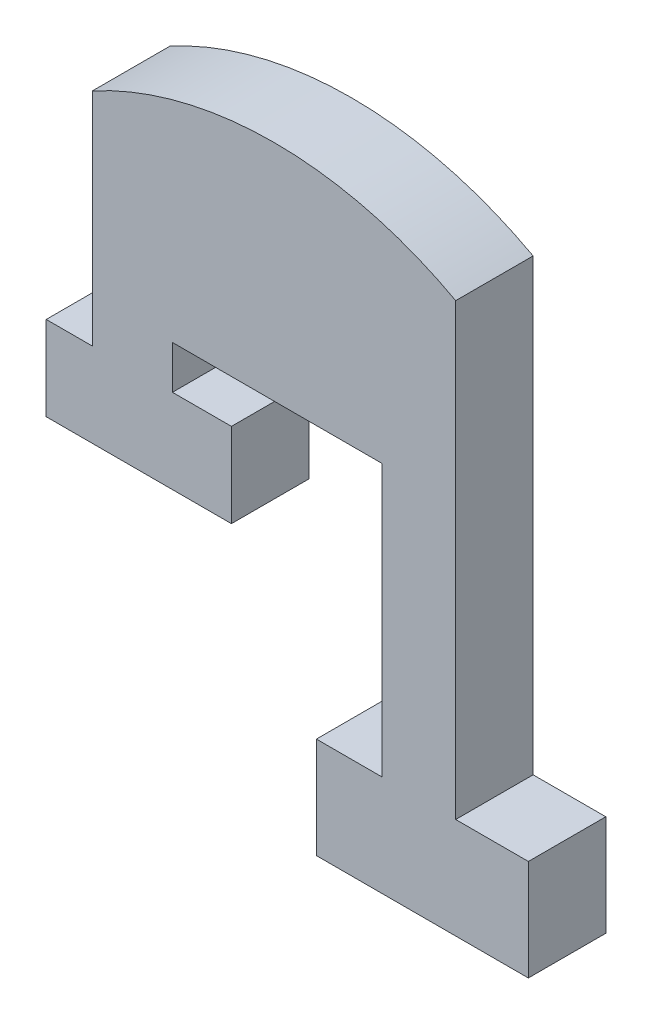
ISO-10303-21;
HEADER;
FILE_DESCRIPTION(('STEP AP214'),'2;1');
FILE_NAME('part.step','',(''),(''),'','','');
FILE_SCHEMA(('AUTOMOTIVE_DESIGN { 1 0 10303 214 1 1 1 1 }'));
ENDSEC;
DATA;
#1=APPLICATION_CONTEXT('core data for automotive mechanical design processes');
#2=APPLICATION_PROTOCOL_DEFINITION('international standard','automotive_design',2000,#1);
#3=PRODUCT_CONTEXT('',#1,'mechanical');
#4=PRODUCT('Part','Part','',(#3));
#5=PRODUCT_RELATED_PRODUCT_CATEGORY('part','',(#4));
#6=PRODUCT_DEFINITION_FORMATION('','',#4);
#7=PRODUCT_DEFINITION_CONTEXT('part definition',#1,'design');
#8=PRODUCT_DEFINITION('design','',#6,#7);
#9=PRODUCT_DEFINITION_SHAPE('','',#8);
#10=(LENGTH_UNIT() NAMED_UNIT(*) SI_UNIT(.MILLI.,.METRE.));
#11=(NAMED_UNIT(*) PLANE_ANGLE_UNIT() SI_UNIT($,.RADIAN.));
#12=(NAMED_UNIT(*) SI_UNIT($,.STERADIAN.) SOLID_ANGLE_UNIT());
#13=UNCERTAINTY_MEASURE_WITH_UNIT(LENGTH_MEASURE(1.E-05),#10,'distance_accuracy_value','');
#14=(GEOMETRIC_REPRESENTATION_CONTEXT(3) GLOBAL_UNCERTAINTY_ASSIGNED_CONTEXT((#13)) GLOBAL_UNIT_ASSIGNED_CONTEXT((#10,
#11,#12)) REPRESENTATION_CONTEXT('',''));
#15=CARTESIAN_POINT('',(0.,0.,0.));
#16=DIRECTION('',(0.,0.,1.));
#17=DIRECTION('',(1.,0.,0.));
#18=AXIS2_PLACEMENT_3D('',#15,#16,#17);
#19=CARTESIAN_POINT('',(16.9520275868381,0.,20.));
#20=DIRECTION('',(-1.,0.,0.));
#21=DIRECTION('',(0.,0.,1.));
#22=AXIS2_PLACEMENT_3D('',#19,#20,#21);
#23=PLANE('',#22);
#24=DIRECTION('',(0.,1.,0.));
#25=VECTOR('',#24,1.);
#26=CARTESIAN_POINT('',(16.9520275868381,0.,0.));
#27=LINE('',#26,#25);
#28=CARTESIAN_POINT('',(16.9520275868381,-70.1347932398303,0.));
#29=VERTEX_POINT('',#28);
#30=CARTESIAN_POINT('',(16.9520275868381,0.,0.));
#31=VERTEX_POINT('',#30);
#32=EDGE_CURVE('E80',#29,#31,#27,.T.);
#33=ORIENTED_EDGE('',*,*,#32,.F.);
#34=DIRECTION('',(0.,0.,1.));
#35=VECTOR('',#34,1.);
#36=CARTESIAN_POINT('',(16.9520275868381,-70.1347932398303,20.));
#37=LINE('',#36,#35);
#38=CARTESIAN_POINT('',(16.9520275868381,-70.1347932398303,20.));
#39=VERTEX_POINT('',#38);
#40=EDGE_CURVE('E173',#29,#39,#37,.T.);
#41=ORIENTED_EDGE('',*,*,#40,.T.);
#42=DIRECTION('',(0.,1.,0.));
#43=VECTOR('',#42,1.);
#44=CARTESIAN_POINT('',(16.9520275868381,0.,20.));
#45=LINE('',#44,#43);
#46=CARTESIAN_POINT('',(16.9520275868381,0.,20.));
#47=VERTEX_POINT('',#46);
#48=EDGE_CURVE('E285',#39,#47,#45,.T.);
#49=ORIENTED_EDGE('',*,*,#48,.T.);
#50=DIRECTION('',(0.,0.,-1.));
#51=VECTOR('',#50,1.);
#52=CARTESIAN_POINT('',(16.9520275868381,0.,20.));
#53=LINE('',#52,#51);
#54=EDGE_CURVE('E310',#47,#31,#53,.T.);
#55=ORIENTED_EDGE('',*,*,#54,.T.);
#56=EDGE_LOOP('',(#33,#41,#49,#55));
#57=FACE_BOUND('',#56,.T.);
#58=ADVANCED_FACE('F43',(#57),#23,.T.);
#59=CARTESIAN_POINT('',(35.982726674984,0.,20.));
#60=DIRECTION('',(1.,0.,0.));
#61=DIRECTION('',(0.,0.,-1.));
#62=AXIS2_PLACEMENT_3D('',#59,#60,#61);
#63=PLANE('',#62);
#64=DIRECTION('',(0.,-1.,0.));
#65=VECTOR('',#64,1.);
#66=CARTESIAN_POINT('',(35.982726674984,0.,20.));
#67=LINE('',#66,#65);
#68=CARTESIAN_POINT('',(35.982726674984,45.936170212766,20.));
#69=VERTEX_POINT('',#68);
#70=CARTESIAN_POINT('',(35.982726674984,-70.1347932398303,20.));
#71=VERTEX_POINT('',#70);
#72=EDGE_CURVE('E288',#69,#71,#67,.T.);
#73=ORIENTED_EDGE('',*,*,#72,.T.);
#74=DIRECTION('',(0.,0.,-1.));
#75=VECTOR('',#74,1.);
#76=CARTESIAN_POINT('',(35.982726674984,-70.1347932398303,20.));
#77=LINE('',#76,#75);
#78=CARTESIAN_POINT('',(35.982726674984,-70.1347932398303,0.));
#79=VERTEX_POINT('',#78);
#80=EDGE_CURVE('E194',#71,#79,#77,.T.);
#81=ORIENTED_EDGE('',*,*,#80,.T.);
#82=DIRECTION('',(0.,-1.,0.));
#83=VECTOR('',#82,1.);
#84=CARTESIAN_POINT('',(35.982726674984,0.,0.));
#85=LINE('',#84,#83);
#86=CARTESIAN_POINT('',(35.982726674984,45.936170212766,0.));
#87=VERTEX_POINT('',#86);
#88=EDGE_CURVE('E274',#87,#79,#85,.T.);
#89=ORIENTED_EDGE('',*,*,#88,.F.);
#90=DIRECTION('',(0.,0.,-1.));
#91=VECTOR('',#90,1.);
#92=CARTESIAN_POINT('',(35.982726674984,45.936170212766,20.));
#93=LINE('',#92,#91);
#94=EDGE_CURVE('E61',#69,#87,#93,.T.);
#95=ORIENTED_EDGE('',*,*,#94,.F.);
#96=EDGE_LOOP('',(#73,#81,#89,#95));
#97=FACE_BOUND('',#96,.T.);
#98=ADVANCED_FACE('F353',(#97),#63,.T.);
#99=CARTESIAN_POINT('',(-57.8583067596665,0.,20.));
#100=DIRECTION('',(-1.,0.,0.));
#101=DIRECTION('',(0.,0.,1.));
#102=AXIS2_PLACEMENT_3D('',#99,#100,#101);
#103=PLANE('',#102);
#104=DIRECTION('',(0.,1.,0.));
#105=VECTOR('',#104,1.);
#106=CARTESIAN_POINT('',(-57.8583067596665,0.,0.));
#107=LINE('',#106,#105);
#108=CARTESIAN_POINT('',(-57.8583067596665,-11.1554942409407,0.));
#109=VERTEX_POINT('',#108);
#110=CARTESIAN_POINT('',(-57.8583067596665,45.936170212766,0.));
#111=VERTEX_POINT('',#110);
#112=EDGE_CURVE('E293',#109,#111,#107,.T.);
#113=ORIENTED_EDGE('',*,*,#112,.F.);
#114=DIRECTION('',(0.,0.,1.));
#115=VECTOR('',#114,1.);
#116=CARTESIAN_POINT('',(-57.8583067596665,-11.1554942409407,20.));
#117=LINE('',#116,#115);
#118=CARTESIAN_POINT('',(-57.8583067596665,-11.1554942409407,20.));
#119=VERTEX_POINT('',#118);
#120=EDGE_CURVE('E267',#109,#119,#117,.T.);
#121=ORIENTED_EDGE('',*,*,#120,.T.);
#122=DIRECTION('',(0.,1.,0.));
#123=VECTOR('',#122,1.);
#124=CARTESIAN_POINT('',(-57.8583067596665,0.,20.));
#125=LINE('',#124,#123);
#126=CARTESIAN_POINT('',(-57.8583067596665,45.936170212766,20.));
#127=VERTEX_POINT('',#126);
#128=EDGE_CURVE('E91',#119,#127,#125,.T.);
#129=ORIENTED_EDGE('',*,*,#128,.T.);
#130=DIRECTION('',(0.,0.,-1.));
#131=VECTOR('',#130,1.);
#132=CARTESIAN_POINT('',(-57.8583067596665,45.936170212766,20.));
#133=LINE('',#132,#131);
#134=EDGE_CURVE('E11',#127,#111,#133,.T.);
#135=ORIENTED_EDGE('',*,*,#134,.T.);
#136=EDGE_LOOP('',(#113,#121,#129,#135));
#137=FACE_BOUND('',#136,.T.);
#138=ADVANCED_FACE('F351',(#137),#103,.T.);
#139=CARTESIAN_POINT('',(-37.1870301639218,0.,20.));
#140=DIRECTION('',(1.,0.,0.));
#141=DIRECTION('',(0.,0.,-1.));
#142=AXIS2_PLACEMENT_3D('',#139,#140,#141);
#143=PLANE('',#142);
#144=DIRECTION('',(0.,-1.,0.));
#145=VECTOR('',#144,1.);
#146=CARTESIAN_POINT('',(-37.1870301639218,0.,20.));
#147=LINE('',#146,#145);
#148=CARTESIAN_POINT('',(-37.1870301639218,0.,20.));
#149=VERTEX_POINT('',#148);
#150=CARTESIAN_POINT('',(-37.1870301639218,-11.1554942409407,20.));
#151=VERTEX_POINT('',#150);
#152=EDGE_CURVE('E277',#149,#151,#147,.T.);
#153=ORIENTED_EDGE('',*,*,#152,.T.);
#154=DIRECTION('',(0.,0.,-1.));
#155=VECTOR('',#154,1.);
#156=CARTESIAN_POINT('',(-37.1870301639218,-11.1554942409407,20.));
#157=LINE('',#156,#155);
#158=CARTESIAN_POINT('',(-37.1870301639218,-11.1554942409407,0.));
#159=VERTEX_POINT('',#158);
#160=EDGE_CURVE('E263',#151,#159,#157,.T.);
#161=ORIENTED_EDGE('',*,*,#160,.T.);
#162=DIRECTION('',(0.,-1.,0.));
#163=VECTOR('',#162,1.);
#164=CARTESIAN_POINT('',(-37.1870301639218,0.,0.));
#165=LINE('',#164,#163);
#166=CARTESIAN_POINT('',(-37.1870301639218,0.,0.));
#167=VERTEX_POINT('',#166);
#168=EDGE_CURVE('E296',#167,#159,#165,.T.);
#169=ORIENTED_EDGE('',*,*,#168,.F.);
#170=DIRECTION('',(0.,0.,-1.));
#171=VECTOR('',#170,1.);
#172=CARTESIAN_POINT('',(-37.1870301639218,0.,20.));
#173=LINE('',#172,#171);
#174=EDGE_CURVE('E53',#149,#167,#173,.T.);
#175=ORIENTED_EDGE('',*,*,#174,.F.);
#176=EDGE_LOOP('',(#153,#161,#169,#175));
#177=FACE_BOUND('',#176,.T.);
#178=ADVANCED_FACE('F321',(#177),#143,.T.);
#179=CARTESIAN_POINT('',(-10.9377900423412,-40.363571372901,20.));
#180=DIRECTION('',(0.,0.,-1.));
#181=DIRECTION('',(-1.,0.,0.));
#182=AXIS2_PLACEMENT_3D('',#179,#180,#181);
#183=CYLINDRICAL_SURFACE('',#182,98.2302412028684);
#184=CARTESIAN_POINT('',(-10.9377900423412,-40.363571372901,0.));
#185=DIRECTION('',(0.,0.,1.));
#186=DIRECTION('',(1.,0.,0.));
#187=AXIS2_PLACEMENT_3D('',#184,#185,#186);
#188=CIRCLE('',#187,98.2302412028684);
#189=EDGE_CURVE('E270',#111,#87,#188,.F.);
#190=ORIENTED_EDGE('',*,*,#189,.F.);
#191=ORIENTED_EDGE('',*,*,#134,.F.);
#192=CARTESIAN_POINT('',(-10.9377900423412,-40.363571372901,20.));
#193=DIRECTION('',(0.,0.,1.));
#194=DIRECTION('',(1.,0.,0.));
#195=AXIS2_PLACEMENT_3D('',#192,#193,#194);
#196=CIRCLE('',#195,98.2302412028684);
#197=EDGE_CURVE('E271',#127,#69,#196,.F.);
#198=ORIENTED_EDGE('',*,*,#197,.T.);
#199=ORIENTED_EDGE('',*,*,#94,.T.);
#200=EDGE_LOOP('',(#190,#191,#198,#199));
#201=FACE_BOUND('',#200,.T.);
#202=ADVANCED_FACE('F45',(#201),#183,.T.);
#203=CARTESIAN_POINT('',(0.,0.,20.));
#204=DIRECTION('',(0.,-1.,0.));
#205=DIRECTION('',(0.,0.,-1.));
#206=AXIS2_PLACEMENT_3D('',#203,#204,#205);
#207=PLANE('',#206);
#208=DIRECTION('',(-1.,0.,0.));
#209=VECTOR('',#208,1.);
#210=CARTESIAN_POINT('',(0.,0.,0.));
#211=LINE('',#210,#209);
#212=EDGE_CURVE('E300',#31,#167,#211,.T.);
#213=ORIENTED_EDGE('',*,*,#212,.F.);
#214=ORIENTED_EDGE('',*,*,#54,.F.);
#215=DIRECTION('',(-1.,0.,0.));
#216=VECTOR('',#215,1.);
#217=CARTESIAN_POINT('',(0.,0.,20.));
#218=LINE('',#217,#216);
#219=EDGE_CURVE('E281',#47,#149,#218,.T.);
#220=ORIENTED_EDGE('',*,*,#219,.T.);
#221=ORIENTED_EDGE('',*,*,#174,.T.);
#222=EDGE_LOOP('',(#213,#214,#220,#221));
#223=FACE_BOUND('',#222,.T.);
#224=ADVANCED_FACE('F316',(#223),#207,.T.);
#225=CARTESIAN_POINT('',(0.,0.,20.));
#226=DIRECTION('',(0.,0.,1.));
#227=DIRECTION('',(1.,0.,0.));
#228=AXIS2_PLACEMENT_3D('',#225,#226,#227);
#229=PLANE('',#228);
#230=ORIENTED_EDGE('',*,*,#48,.F.);
#231=DIRECTION('',(-1.,0.,0.));
#232=VECTOR('',#231,1.);
#233=CARTESIAN_POINT('',(0.,-70.1347932398303,20.));
#234=LINE('',#233,#232);
#235=CARTESIAN_POINT('',(0.,-70.1347932398303,20.));
#236=VERTEX_POINT('',#235);
#237=EDGE_CURVE('E186',#39,#236,#234,.T.);
#238=ORIENTED_EDGE('',*,*,#237,.T.);
#239=DIRECTION('',(0.,-1.,0.));
#240=VECTOR('',#239,1.);
#241=CARTESIAN_POINT('',(0.,-70.1347932398303,20.));
#242=LINE('',#241,#240);
#243=CARTESIAN_POINT('',(0.,-96.2071872178802,20.));
#244=VERTEX_POINT('',#243);
#245=EDGE_CURVE('E177',#236,#244,#242,.T.);
#246=ORIENTED_EDGE('',*,*,#245,.T.);
#247=DIRECTION('',(1.,0.,0.));
#248=VECTOR('',#247,1.);
#249=CARTESIAN_POINT('',(0.,-96.2071872178802,20.));
#250=LINE('',#249,#248);
#251=CARTESIAN_POINT('',(54.7494549800272,-96.2071872178802,20.));
#252=VERTEX_POINT('',#251);
#253=EDGE_CURVE('E211',#244,#252,#250,.T.);
#254=ORIENTED_EDGE('',*,*,#253,.T.);
#255=DIRECTION('',(0.,1.,0.));
#256=VECTOR('',#255,1.);
#257=CARTESIAN_POINT('',(54.7494549800272,-70.1347932398303,20.));
#258=LINE('',#257,#256);
#259=CARTESIAN_POINT('',(54.7494549800272,-70.1347932398303,20.));
#260=VERTEX_POINT('',#259);
#261=EDGE_CURVE('E208',#252,#260,#258,.T.);
#262=ORIENTED_EDGE('',*,*,#261,.T.);
#263=EDGE_CURVE('E204',#260,#71,#234,.T.);
#264=ORIENTED_EDGE('',*,*,#263,.T.);
#265=ORIENTED_EDGE('',*,*,#72,.F.);
#266=ORIENTED_EDGE('',*,*,#197,.F.);
#267=ORIENTED_EDGE('',*,*,#128,.F.);
#268=DIRECTION('',(-1.,0.,0.));
#269=VECTOR('',#268,1.);
#270=CARTESIAN_POINT('',(-69.7905240219199,-11.1554942409407,20.));
#271=LINE('',#270,#269);
#272=CARTESIAN_POINT('',(-69.7905240219199,-11.1554942409407,20.));
#273=VERTEX_POINT('',#272);
#274=EDGE_CURVE('E230',#119,#273,#271,.T.);
#275=ORIENTED_EDGE('',*,*,#274,.T.);
#276=DIRECTION('',(0.,-1.,0.));
#277=VECTOR('',#276,1.);
#278=CARTESIAN_POINT('',(-69.7905240219199,-11.1554942409407,20.));
#279=LINE('',#278,#277);
#280=CARTESIAN_POINT('',(-69.7905240219199,-32.9246775624193,20.));
#281=VERTEX_POINT('',#280);
#282=EDGE_CURVE('E219',#273,#281,#279,.T.);
#283=ORIENTED_EDGE('',*,*,#282,.T.);
#284=DIRECTION('',(1.,0.,0.));
#285=VECTOR('',#284,1.);
#286=CARTESIAN_POINT('',(-69.7905240219199,-32.9246775624193,20.));
#287=LINE('',#286,#285);
#288=CARTESIAN_POINT('',(-21.9489467223914,-32.9246775624193,20.));
#289=VERTEX_POINT('',#288);
#290=EDGE_CURVE('E223',#281,#289,#287,.T.);
#291=ORIENTED_EDGE('',*,*,#290,.T.);
#292=DIRECTION('',(0.,1.,0.));
#293=VECTOR('',#292,1.);
#294=CARTESIAN_POINT('',(-21.9489467223914,-11.1554942409407,20.));
#295=LINE('',#294,#293);
#296=CARTESIAN_POINT('',(-21.9489467223914,-11.1554942409407,20.));
#297=VERTEX_POINT('',#296);
#298=EDGE_CURVE('E227',#289,#297,#295,.T.);
#299=ORIENTED_EDGE('',*,*,#298,.T.);
#300=EDGE_CURVE('E231',#297,#151,#271,.T.);
#301=ORIENTED_EDGE('',*,*,#300,.T.);
#302=ORIENTED_EDGE('',*,*,#152,.F.);
#303=ORIENTED_EDGE('',*,*,#219,.F.);
#304=EDGE_LOOP('',(#230,#238,#246,#254,#262,#264,#265,#266,#267,#275,#283,#291,#299,#301,#302,#303));
#305=FACE_BOUND('',#304,.T.);
#306=ADVANCED_FACE('F348',(#305),#229,.T.);
#307=CARTESIAN_POINT('',(0.,0.,0.));
#308=DIRECTION('',(0.,0.,1.));
#309=DIRECTION('',(1.,0.,0.));
#310=AXIS2_PLACEMENT_3D('',#307,#308,#309);
#311=PLANE('',#310);
#312=DIRECTION('',(-1.,0.,0.));
#313=VECTOR('',#312,1.);
#314=CARTESIAN_POINT('',(0.,-70.1347932398303,0.));
#315=LINE('',#314,#313);
#316=CARTESIAN_POINT('',(0.,-70.1347932398303,0.));
#317=VERTEX_POINT('',#316);
#318=EDGE_CURVE('E167',#29,#317,#315,.T.);
#319=ORIENTED_EDGE('',*,*,#318,.F.);
#320=ORIENTED_EDGE('',*,*,#32,.T.);
#321=ORIENTED_EDGE('',*,*,#212,.T.);
#322=ORIENTED_EDGE('',*,*,#168,.T.);
#323=DIRECTION('',(-1.,0.,0.));
#324=VECTOR('',#323,1.);
#325=CARTESIAN_POINT('',(-69.7905240219199,-11.1554942409407,0.));
#326=LINE('',#325,#324);
#327=CARTESIAN_POINT('',(-21.9489467223914,-11.1554942409407,0.));
#328=VERTEX_POINT('',#327);
#329=EDGE_CURVE('E224',#328,#159,#326,.T.);
#330=ORIENTED_EDGE('',*,*,#329,.F.);
#331=DIRECTION('',(0.,1.,0.));
#332=VECTOR('',#331,1.);
#333=CARTESIAN_POINT('',(-21.9489467223914,-11.1554942409407,0.));
#334=LINE('',#333,#332);
#335=CARTESIAN_POINT('',(-21.9489467223914,-32.9246775624193,0.));
#336=VERTEX_POINT('',#335);
#337=EDGE_CURVE('E242',#336,#328,#334,.T.);
#338=ORIENTED_EDGE('',*,*,#337,.F.);
#339=DIRECTION('',(1.,0.,0.));
#340=VECTOR('',#339,1.);
#341=CARTESIAN_POINT('',(-69.7905240219199,-32.9246775624193,0.));
#342=LINE('',#341,#340);
#343=CARTESIAN_POINT('',(-69.7905240219199,-32.9246775624193,0.));
#344=VERTEX_POINT('',#343);
#345=EDGE_CURVE('E239',#344,#336,#342,.T.);
#346=ORIENTED_EDGE('',*,*,#345,.F.);
#347=DIRECTION('',(0.,-1.,0.));
#348=VECTOR('',#347,1.);
#349=CARTESIAN_POINT('',(-69.7905240219199,-11.1554942409407,0.));
#350=LINE('',#349,#348);
#351=CARTESIAN_POINT('',(-69.7905240219199,-11.1554942409407,0.));
#352=VERTEX_POINT('',#351);
#353=EDGE_CURVE('E218',#352,#344,#350,.T.);
#354=ORIENTED_EDGE('',*,*,#353,.F.);
#355=EDGE_CURVE('E245',#109,#352,#326,.T.);
#356=ORIENTED_EDGE('',*,*,#355,.F.);
#357=ORIENTED_EDGE('',*,*,#112,.T.);
#358=ORIENTED_EDGE('',*,*,#189,.T.);
#359=ORIENTED_EDGE('',*,*,#88,.T.);
#360=CARTESIAN_POINT('',(54.7494549800272,-70.1347932398303,0.));
#361=VERTEX_POINT('',#360);
#362=EDGE_CURVE('E176',#361,#79,#315,.T.);
#363=ORIENTED_EDGE('',*,*,#362,.F.);
#364=DIRECTION('',(0.,1.,0.));
#365=VECTOR('',#364,1.);
#366=CARTESIAN_POINT('',(54.7494549800272,-70.1347932398303,0.));
#367=LINE('',#366,#365);
#368=CARTESIAN_POINT('',(54.7494549800272,-96.2071872178802,0.));
#369=VERTEX_POINT('',#368);
#370=EDGE_CURVE('E200',#369,#361,#367,.T.);
#371=ORIENTED_EDGE('',*,*,#370,.F.);
#372=DIRECTION('',(1.,0.,0.));
#373=VECTOR('',#372,1.);
#374=CARTESIAN_POINT('',(0.,-96.2071872178802,0.));
#375=LINE('',#374,#373);
#376=CARTESIAN_POINT('',(0.,-96.2071872178802,0.));
#377=VERTEX_POINT('',#376);
#378=EDGE_CURVE('E191',#377,#369,#375,.T.);
#379=ORIENTED_EDGE('',*,*,#378,.F.);
#380=DIRECTION('',(0.,-1.,0.));
#381=VECTOR('',#380,1.);
#382=CARTESIAN_POINT('',(0.,-70.1347932398303,0.));
#383=LINE('',#382,#381);
#384=EDGE_CURVE('E183',#317,#377,#383,.T.);
#385=ORIENTED_EDGE('',*,*,#384,.F.);
#386=EDGE_LOOP('',(#319,#320,#321,#322,#330,#338,#346,#354,#356,#357,#358,#359,#363,#371,#379,#385));
#387=FACE_BOUND('',#386,.T.);
#388=ADVANCED_FACE('F189',(#387),#311,.F.);
#389=CARTESIAN_POINT('',(-69.7905240219199,-11.1554942409407,20.));
#390=DIRECTION('',(0.,-1.,0.));
#391=DIRECTION('',(0.,0.,-1.));
#392=AXIS2_PLACEMENT_3D('',#389,#390,#391);
#393=PLANE('',#392);
#394=ORIENTED_EDGE('',*,*,#120,.F.);
#395=ORIENTED_EDGE('',*,*,#355,.T.);
#396=DIRECTION('',(0.,0.,-1.));
#397=VECTOR('',#396,1.);
#398=CARTESIAN_POINT('',(-69.7905240219199,-11.1554942409407,20.));
#399=LINE('',#398,#397);
#400=EDGE_CURVE('E235',#273,#352,#399,.T.);
#401=ORIENTED_EDGE('',*,*,#400,.F.);
#402=ORIENTED_EDGE('',*,*,#274,.F.);
#403=EDGE_LOOP('',(#394,#395,#401,#402));
#404=FACE_BOUND('',#403,.T.);
#405=ADVANCED_FACE('F343',(#404),#393,.F.);
#406=CARTESIAN_POINT('',(-69.7905240219199,-11.1554942409407,20.));
#407=DIRECTION('',(1.,0.,0.));
#408=DIRECTION('',(0.,0.,-1.));
#409=AXIS2_PLACEMENT_3D('',#406,#407,#408);
#410=PLANE('',#409);
#411=ORIENTED_EDGE('',*,*,#353,.T.);
#412=DIRECTION('',(0.,0.,-1.));
#413=VECTOR('',#412,1.);
#414=CARTESIAN_POINT('',(-69.7905240219199,-32.9246775624193,20.));
#415=LINE('',#414,#413);
#416=EDGE_CURVE('E259',#281,#344,#415,.T.);
#417=ORIENTED_EDGE('',*,*,#416,.F.);
#418=ORIENTED_EDGE('',*,*,#282,.F.);
#419=ORIENTED_EDGE('',*,*,#400,.T.);
#420=EDGE_LOOP('',(#411,#417,#418,#419));
#421=FACE_BOUND('',#420,.T.);
#422=ADVANCED_FACE('F339',(#421),#410,.F.);
#423=CARTESIAN_POINT('',(-69.7905240219199,-32.9246775624193,20.));
#424=DIRECTION('',(0.,1.,0.));
#425=DIRECTION('',(0.,0.,1.));
#426=AXIS2_PLACEMENT_3D('',#423,#424,#425);
#427=PLANE('',#426);
#428=ORIENTED_EDGE('',*,*,#345,.T.);
#429=DIRECTION('',(0.,0.,-1.));
#430=VECTOR('',#429,1.);
#431=CARTESIAN_POINT('',(-21.9489467223914,-32.9246775624193,20.));
#432=LINE('',#431,#430);
#433=EDGE_CURVE('E255',#289,#336,#432,.T.);
#434=ORIENTED_EDGE('',*,*,#433,.F.);
#435=ORIENTED_EDGE('',*,*,#290,.F.);
#436=ORIENTED_EDGE('',*,*,#416,.T.);
#437=EDGE_LOOP('',(#428,#434,#435,#436));
#438=FACE_BOUND('',#437,.T.);
#439=ADVANCED_FACE('F333',(#438),#427,.F.);
#440=CARTESIAN_POINT('',(-21.9489467223914,-11.1554942409407,20.));
#441=DIRECTION('',(-1.,0.,0.));
#442=DIRECTION('',(0.,0.,1.));
#443=AXIS2_PLACEMENT_3D('',#440,#441,#442);
#444=PLANE('',#443);
#445=ORIENTED_EDGE('',*,*,#337,.T.);
#446=DIRECTION('',(0.,0.,-1.));
#447=VECTOR('',#446,1.);
#448=CARTESIAN_POINT('',(-21.9489467223914,-11.1554942409407,20.));
#449=LINE('',#448,#447);
#450=EDGE_CURVE('E251',#297,#328,#449,.T.);
#451=ORIENTED_EDGE('',*,*,#450,.F.);
#452=ORIENTED_EDGE('',*,*,#298,.F.);
#453=ORIENTED_EDGE('',*,*,#433,.T.);
#454=EDGE_LOOP('',(#445,#451,#452,#453));
#455=FACE_BOUND('',#454,.T.);
#456=ADVANCED_FACE('F330',(#455),#444,.F.);
#457=ORIENTED_EDGE('',*,*,#160,.F.);
#458=ORIENTED_EDGE('',*,*,#300,.F.);
#459=ORIENTED_EDGE('',*,*,#450,.T.);
#460=ORIENTED_EDGE('',*,*,#329,.T.);
#461=EDGE_LOOP('',(#457,#458,#459,#460));
#462=FACE_BOUND('',#461,.T.);
#463=ADVANCED_FACE('F325',(#462),#393,.F.);
#464=CARTESIAN_POINT('',(0.,-70.1347932398303,20.));
#465=DIRECTION('',(0.,-1.,0.));
#466=DIRECTION('',(0.,0.,-1.));
#467=AXIS2_PLACEMENT_3D('',#464,#465,#466);
#468=PLANE('',#467);
#469=ORIENTED_EDGE('',*,*,#40,.F.);
#470=ORIENTED_EDGE('',*,*,#318,.T.);
#471=DIRECTION('',(0.,0.,-1.));
#472=VECTOR('',#471,1.);
#473=CARTESIAN_POINT('',(0.,-70.1347932398303,20.));
#474=LINE('',#473,#472);
#475=EDGE_CURVE('E170',#236,#317,#474,.T.);
#476=ORIENTED_EDGE('',*,*,#475,.F.);
#477=ORIENTED_EDGE('',*,*,#237,.F.);
#478=EDGE_LOOP('',(#469,#470,#476,#477));
#479=FACE_BOUND('',#478,.T.);
#480=ADVANCED_FACE('F169',(#479),#468,.F.);
#481=CARTESIAN_POINT('',(0.,-70.1347932398303,20.));
#482=DIRECTION('',(1.,0.,0.));
#483=DIRECTION('',(0.,0.,-1.));
#484=AXIS2_PLACEMENT_3D('',#481,#482,#483);
#485=PLANE('',#484);
#486=ORIENTED_EDGE('',*,*,#384,.T.);
#487=DIRECTION('',(0.,0.,-1.));
#488=VECTOR('',#487,1.);
#489=CARTESIAN_POINT('',(0.,-96.2071872178802,20.));
#490=LINE('',#489,#488);
#491=EDGE_CURVE('E368',#244,#377,#490,.T.);
#492=ORIENTED_EDGE('',*,*,#491,.F.);
#493=ORIENTED_EDGE('',*,*,#245,.F.);
#494=ORIENTED_EDGE('',*,*,#475,.T.);
#495=EDGE_LOOP('',(#486,#492,#493,#494));
#496=FACE_BOUND('',#495,.T.);
#497=ADVANCED_FACE('F181',(#496),#485,.F.);
#498=CARTESIAN_POINT('',(0.,-96.2071872178802,20.));
#499=DIRECTION('',(0.,1.,0.));
#500=DIRECTION('',(0.,0.,1.));
#501=AXIS2_PLACEMENT_3D('',#498,#499,#500);
#502=PLANE('',#501);
#503=ORIENTED_EDGE('',*,*,#378,.T.);
#504=DIRECTION('',(0.,0.,-1.));
#505=VECTOR('',#504,1.);
#506=CARTESIAN_POINT('',(54.7494549800272,-96.2071872178802,20.));
#507=LINE('',#506,#505);
#508=EDGE_CURVE('E365',#252,#369,#507,.T.);
#509=ORIENTED_EDGE('',*,*,#508,.F.);
#510=ORIENTED_EDGE('',*,*,#253,.F.);
#511=ORIENTED_EDGE('',*,*,#491,.T.);
#512=EDGE_LOOP('',(#503,#509,#510,#511));
#513=FACE_BOUND('',#512,.T.);
#514=ADVANCED_FACE('F456',(#513),#502,.F.);
#515=CARTESIAN_POINT('',(54.7494549800272,-70.1347932398303,20.));
#516=DIRECTION('',(-1.,0.,0.));
#517=DIRECTION('',(0.,0.,1.));
#518=AXIS2_PLACEMENT_3D('',#515,#516,#517);
#519=PLANE('',#518);
#520=ORIENTED_EDGE('',*,*,#370,.T.);
#521=DIRECTION('',(0.,0.,-1.));
#522=VECTOR('',#521,1.);
#523=CARTESIAN_POINT('',(54.7494549800272,-70.1347932398303,20.));
#524=LINE('',#523,#522);
#525=EDGE_CURVE('E187',#260,#361,#524,.T.);
#526=ORIENTED_EDGE('',*,*,#525,.F.);
#527=ORIENTED_EDGE('',*,*,#261,.F.);
#528=ORIENTED_EDGE('',*,*,#508,.T.);
#529=EDGE_LOOP('',(#520,#526,#527,#528));
#530=FACE_BOUND('',#529,.T.);
#531=ADVANCED_FACE('F363',(#530),#519,.F.);
#532=ORIENTED_EDGE('',*,*,#80,.F.);
#533=ORIENTED_EDGE('',*,*,#263,.F.);
#534=ORIENTED_EDGE('',*,*,#525,.T.);
#535=ORIENTED_EDGE('',*,*,#362,.T.);
#536=EDGE_LOOP('',(#532,#533,#534,#535));
#537=FACE_BOUND('',#536,.T.);
#538=ADVANCED_FACE('F356',(#537),#468,.F.);
#539=CLOSED_SHELL('',(#58,#98,#138,#178,#202,#224,#306,#388,#405,#422,#439,#456,#463,#480,#497,
#514,#531,#538));
#540=MANIFOLD_SOLID_BREP('B2',#539);
#541=ADVANCED_BREP_SHAPE_REPRESENTATION('',(#18,#540),#14);
#542=SHAPE_DEFINITION_REPRESENTATION(#9,#541);
ENDSEC;
END-ISO-10303-21;
